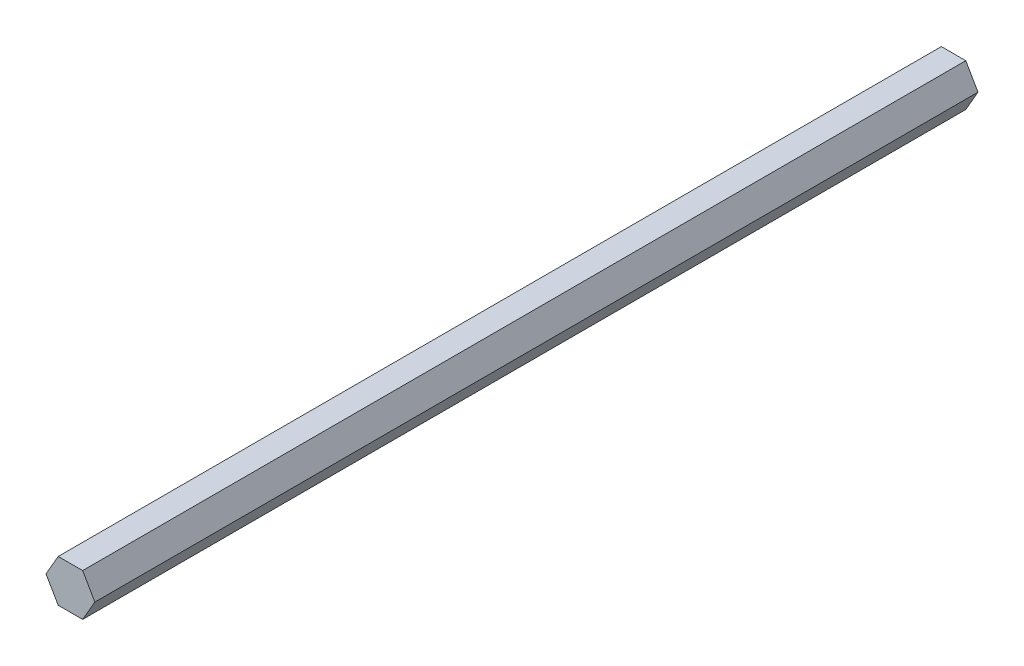
ISO-10303-21;
HEADER;
FILE_DESCRIPTION(('STEP AP214'),'2;1');
FILE_NAME('part.step','',(''),(''),'','','');
FILE_SCHEMA(('AUTOMOTIVE_DESIGN { 1 0 10303 214 1 1 1 1 }'));
ENDSEC;
DATA;
#1=APPLICATION_CONTEXT('core data for automotive mechanical design processes');
#2=APPLICATION_PROTOCOL_DEFINITION('international standard','automotive_design',2000,#1);
#3=PRODUCT_CONTEXT('',#1,'mechanical');
#4=PRODUCT('Part','Part','',(#3));
#5=PRODUCT_RELATED_PRODUCT_CATEGORY('part','',(#4));
#6=PRODUCT_DEFINITION_FORMATION('','',#4);
#7=PRODUCT_DEFINITION_CONTEXT('part definition',#1,'design');
#8=PRODUCT_DEFINITION('design','',#6,#7);
#9=PRODUCT_DEFINITION_SHAPE('','',#8);
#10=(LENGTH_UNIT() NAMED_UNIT(*) SI_UNIT(.MILLI.,.METRE.));
#11=(NAMED_UNIT(*) PLANE_ANGLE_UNIT() SI_UNIT($,.RADIAN.));
#12=(NAMED_UNIT(*) SI_UNIT($,.STERADIAN.) SOLID_ANGLE_UNIT());
#13=UNCERTAINTY_MEASURE_WITH_UNIT(LENGTH_MEASURE(1.E-05),#10,'distance_accuracy_value','');
#14=(GEOMETRIC_REPRESENTATION_CONTEXT(3) GLOBAL_UNCERTAINTY_ASSIGNED_CONTEXT((#13)) GLOBAL_UNIT_ASSIGNED_CONTEXT((#10,
#11,#12)) REPRESENTATION_CONTEXT('',''));
#15=CARTESIAN_POINT('',(0.,0.,0.));
#16=DIRECTION('',(0.,0.,1.));
#17=DIRECTION('',(1.,0.,0.));
#18=AXIS2_PLACEMENT_3D('',#15,#16,#17);
#19=CARTESIAN_POINT('',(3.6661742093542,-6.34999999999996,132.5));
#20=DIRECTION('',(-0.866025403784442,0.499999999999995,0.));
#21=DIRECTION('',(-0.499999999999995,-0.866025403784442,0.));
#22=AXIS2_PLACEMENT_3D('',#19,#20,#21);
#23=PLANE('',#22);
#24=DIRECTION('',(0.499999999999995,0.866025403784442,0.));
#25=VECTOR('',#24,1.);
#26=CARTESIAN_POINT('',(3.6661742093542,-6.34999999999996,-132.5));
#27=LINE('',#26,#25);
#28=CARTESIAN_POINT('',(3.6661742093542,-6.34999999999996,-132.5));
#29=VERTEX_POINT('',#28);
#30=CARTESIAN_POINT('',(7.33234841870825,0.,-132.5));
#31=VERTEX_POINT('',#30);
#32=EDGE_CURVE('E123',#29,#31,#27,.T.);
#33=ORIENTED_EDGE('',*,*,#32,.T.);
#34=DIRECTION('',(0.,0.,-1.));
#35=VECTOR('',#34,1.);
#36=CARTESIAN_POINT('',(7.33234841870825,0.,132.5));
#37=LINE('',#36,#35);
#38=CARTESIAN_POINT('',(7.33234841870825,0.,132.5));
#39=VERTEX_POINT('',#38);
#40=EDGE_CURVE('E11',#39,#31,#37,.T.);
#41=ORIENTED_EDGE('',*,*,#40,.F.);
#42=DIRECTION('',(0.499999999999995,0.866025403784442,0.));
#43=VECTOR('',#42,1.);
#44=CARTESIAN_POINT('',(3.6661742093542,-6.34999999999996,132.5));
#45=LINE('',#44,#43);
#46=CARTESIAN_POINT('',(3.6661742093542,-6.34999999999996,132.5));
#47=VERTEX_POINT('',#46);
#48=EDGE_CURVE('E133',#47,#39,#45,.T.);
#49=ORIENTED_EDGE('',*,*,#48,.F.);
#50=DIRECTION('',(0.,0.,-1.));
#51=VECTOR('',#50,1.);
#52=CARTESIAN_POINT('',(3.6661742093542,-6.34999999999996,132.5));
#53=LINE('',#52,#51);
#54=EDGE_CURVE('E119',#47,#29,#53,.T.);
#55=ORIENTED_EDGE('',*,*,#54,.T.);
#56=EDGE_LOOP('',(#33,#41,#49,#55));
#57=FACE_BOUND('',#56,.T.);
#58=ADVANCED_FACE('F39',(#57),#23,.F.);
#59=CARTESIAN_POINT('',(7.33234841870825,0.,132.5));
#60=DIRECTION('',(-0.866025403784438,-0.500000000000001,0.));
#61=DIRECTION('',(0.500000000000001,-0.866025403784438,0.));
#62=AXIS2_PLACEMENT_3D('',#59,#60,#61);
#63=PLANE('',#62);
#64=DIRECTION('',(-0.500000000000001,0.866025403784438,0.));
#65=VECTOR('',#64,1.);
#66=CARTESIAN_POINT('',(7.33234841870825,0.,-132.5));
#67=LINE('',#66,#65);
#68=CARTESIAN_POINT('',(3.66617420935411,6.35000000000001,-132.5));
#69=VERTEX_POINT('',#68);
#70=EDGE_CURVE('E126',#31,#69,#67,.T.);
#71=ORIENTED_EDGE('',*,*,#70,.T.);
#72=DIRECTION('',(0.,0.,-1.));
#73=VECTOR('',#72,1.);
#74=CARTESIAN_POINT('',(3.66617420935411,6.35000000000001,132.5));
#75=LINE('',#74,#73);
#76=CARTESIAN_POINT('',(3.66617420935411,6.35000000000001,132.5));
#77=VERTEX_POINT('',#76);
#78=EDGE_CURVE('E47',#77,#69,#75,.T.);
#79=ORIENTED_EDGE('',*,*,#78,.F.);
#80=DIRECTION('',(-0.500000000000001,0.866025403784438,0.));
#81=VECTOR('',#80,1.);
#82=CARTESIAN_POINT('',(7.33234841870825,0.,132.5));
#83=LINE('',#82,#81);
#84=EDGE_CURVE('E92',#39,#77,#83,.T.);
#85=ORIENTED_EDGE('',*,*,#84,.F.);
#86=ORIENTED_EDGE('',*,*,#40,.T.);
#87=EDGE_LOOP('',(#71,#79,#85,#86));
#88=FACE_BOUND('',#87,.T.);
#89=ADVANCED_FACE('F157',(#88),#63,.F.);
#90=CARTESIAN_POINT('',(3.66617420935411,6.35000000000001,132.5));
#91=DIRECTION('',(0.,-1.,0.));
#92=DIRECTION('',(1.,0.,0.));
#93=AXIS2_PLACEMENT_3D('',#90,#91,#92);
#94=PLANE('',#93);
#95=DIRECTION('',(-1.,0.,0.));
#96=VECTOR('',#95,1.);
#97=CARTESIAN_POINT('',(3.66617420935411,6.35000000000001,-132.5));
#98=LINE('',#97,#96);
#99=CARTESIAN_POINT('',(-3.66617420935415,6.34999999999999,-132.5));
#100=VERTEX_POINT('',#99);
#101=EDGE_CURVE('E128',#69,#100,#98,.T.);
#102=ORIENTED_EDGE('',*,*,#101,.T.);
#103=DIRECTION('',(0.,0.,-1.));
#104=VECTOR('',#103,1.);
#105=CARTESIAN_POINT('',(-3.66617420935415,6.34999999999999,132.5));
#106=LINE('',#105,#104);
#107=CARTESIAN_POINT('',(-3.66617420935415,6.34999999999999,132.5));
#108=VERTEX_POINT('',#107);
#109=EDGE_CURVE('E114',#108,#100,#106,.T.);
#110=ORIENTED_EDGE('',*,*,#109,.F.);
#111=DIRECTION('',(-1.,0.,0.));
#112=VECTOR('',#111,1.);
#113=CARTESIAN_POINT('',(3.66617420935411,6.35000000000001,132.5));
#114=LINE('',#113,#112);
#115=EDGE_CURVE('E105',#77,#108,#114,.T.);
#116=ORIENTED_EDGE('',*,*,#115,.F.);
#117=ORIENTED_EDGE('',*,*,#78,.T.);
#118=EDGE_LOOP('',(#102,#110,#116,#117));
#119=FACE_BOUND('',#118,.T.);
#120=ADVANCED_FACE('F139',(#119),#94,.F.);
#121=CARTESIAN_POINT('',(-3.66617420935415,6.34999999999999,132.5));
#122=DIRECTION('',(0.866025403784442,-0.499999999999995,0.));
#123=DIRECTION('',(0.499999999999995,0.866025403784442,0.));
#124=AXIS2_PLACEMENT_3D('',#121,#122,#123);
#125=PLANE('',#124);
#126=DIRECTION('',(-0.499999999999995,-0.866025403784442,0.));
#127=VECTOR('',#126,1.);
#128=CARTESIAN_POINT('',(-3.66617420935415,6.34999999999999,-132.5));
#129=LINE('',#128,#127);
#130=CARTESIAN_POINT('',(-7.33234841870825,0.,-132.5));
#131=VERTEX_POINT('',#130);
#132=EDGE_CURVE('E113',#100,#131,#129,.T.);
#133=ORIENTED_EDGE('',*,*,#132,.T.);
#134=DIRECTION('',(0.,0.,-1.));
#135=VECTOR('',#134,1.);
#136=CARTESIAN_POINT('',(-7.33234841870825,0.,132.5));
#137=LINE('',#136,#135);
#138=CARTESIAN_POINT('',(-7.33234841870825,0.,132.5));
#139=VERTEX_POINT('',#138);
#140=EDGE_CURVE('E110',#139,#131,#137,.T.);
#141=ORIENTED_EDGE('',*,*,#140,.F.);
#142=DIRECTION('',(-0.499999999999995,-0.866025403784442,0.));
#143=VECTOR('',#142,1.);
#144=CARTESIAN_POINT('',(-3.66617420935415,6.34999999999999,132.5));
#145=LINE('',#144,#143);
#146=EDGE_CURVE('E99',#108,#139,#145,.T.);
#147=ORIENTED_EDGE('',*,*,#146,.F.);
#148=ORIENTED_EDGE('',*,*,#109,.T.);
#149=EDGE_LOOP('',(#133,#141,#147,#148));
#150=FACE_BOUND('',#149,.T.);
#151=ADVANCED_FACE('F111',(#150),#125,.F.);
#152=CARTESIAN_POINT('',(-7.33234841870825,0.,132.5));
#153=DIRECTION('',(0.866025403784435,0.500000000000007,0.));
#154=DIRECTION('',(-0.500000000000007,0.866025403784435,0.));
#155=AXIS2_PLACEMENT_3D('',#152,#153,#154);
#156=PLANE('',#155);
#157=DIRECTION('',(0.500000000000007,-0.866025403784435,0.));
#158=VECTOR('',#157,1.);
#159=CARTESIAN_POINT('',(-7.33234841870825,0.,-132.5));
#160=LINE('',#159,#158);
#161=CARTESIAN_POINT('',(-3.66617420935407,-6.35000000000004,-132.5));
#162=VERTEX_POINT('',#161);
#163=EDGE_CURVE('E78',#131,#162,#160,.T.);
#164=ORIENTED_EDGE('',*,*,#163,.T.);
#165=DIRECTION('',(0.,0.,-1.));
#166=VECTOR('',#165,1.);
#167=CARTESIAN_POINT('',(-3.66617420935407,-6.35000000000004,132.5));
#168=LINE('',#167,#166);
#169=CARTESIAN_POINT('',(-3.66617420935407,-6.35000000000004,132.5));
#170=VERTEX_POINT('',#169);
#171=EDGE_CURVE('E115',#170,#162,#168,.T.);
#172=ORIENTED_EDGE('',*,*,#171,.F.);
#173=DIRECTION('',(0.500000000000007,-0.866025403784435,0.));
#174=VECTOR('',#173,1.);
#175=CARTESIAN_POINT('',(-7.33234841870825,0.,132.5));
#176=LINE('',#175,#174);
#177=EDGE_CURVE('E103',#139,#170,#176,.T.);
#178=ORIENTED_EDGE('',*,*,#177,.F.);
#179=ORIENTED_EDGE('',*,*,#140,.T.);
#180=EDGE_LOOP('',(#164,#172,#178,#179));
#181=FACE_BOUND('',#180,.T.);
#182=ADVANCED_FACE('F117',(#181),#156,.F.);
#183=CARTESIAN_POINT('',(-3.66617420935407,-6.35000000000004,132.5));
#184=DIRECTION('',(0.,1.,0.));
#185=DIRECTION('',(-1.,0.,0.));
#186=AXIS2_PLACEMENT_3D('',#183,#184,#185);
#187=PLANE('',#186);
#188=DIRECTION('',(1.,0.,0.));
#189=VECTOR('',#188,1.);
#190=CARTESIAN_POINT('',(-3.66617420935407,-6.35000000000004,-132.5));
#191=LINE('',#190,#189);
#192=EDGE_CURVE('E84',#162,#29,#191,.T.);
#193=ORIENTED_EDGE('',*,*,#192,.T.);
#194=ORIENTED_EDGE('',*,*,#54,.F.);
#195=DIRECTION('',(1.,0.,0.));
#196=VECTOR('',#195,1.);
#197=CARTESIAN_POINT('',(-3.66617420935407,-6.35000000000004,132.5));
#198=LINE('',#197,#196);
#199=EDGE_CURVE('E55',#170,#47,#198,.T.);
#200=ORIENTED_EDGE('',*,*,#199,.F.);
#201=ORIENTED_EDGE('',*,*,#171,.T.);
#202=EDGE_LOOP('',(#193,#194,#200,#201));
#203=FACE_BOUND('',#202,.T.);
#204=ADVANCED_FACE('F146',(#203),#187,.F.);
#205=CARTESIAN_POINT('',(0.,0.,132.5));
#206=DIRECTION('',(0.,0.,1.));
#207=DIRECTION('',(1.,0.,0.));
#208=AXIS2_PLACEMENT_3D('',#205,#206,#207);
#209=PLANE('',#208);
#210=ORIENTED_EDGE('',*,*,#48,.T.);
#211=ORIENTED_EDGE('',*,*,#84,.T.);
#212=ORIENTED_EDGE('',*,*,#115,.T.);
#213=ORIENTED_EDGE('',*,*,#146,.T.);
#214=ORIENTED_EDGE('',*,*,#177,.T.);
#215=ORIENTED_EDGE('',*,*,#199,.T.);
#216=EDGE_LOOP('',(#210,#211,#212,#213,#214,#215));
#217=FACE_BOUND('',#216,.T.);
#218=ADVANCED_FACE('F101',(#217),#209,.T.);
#219=CARTESIAN_POINT('',(0.,0.,-132.5));
#220=DIRECTION('',(0.,0.,1.));
#221=DIRECTION('',(1.,0.,0.));
#222=AXIS2_PLACEMENT_3D('',#219,#220,#221);
#223=PLANE('',#222);
#224=ORIENTED_EDGE('',*,*,#32,.F.);
#225=ORIENTED_EDGE('',*,*,#192,.F.);
#226=ORIENTED_EDGE('',*,*,#163,.F.);
#227=ORIENTED_EDGE('',*,*,#132,.F.);
#228=ORIENTED_EDGE('',*,*,#101,.F.);
#229=ORIENTED_EDGE('',*,*,#70,.F.);
#230=EDGE_LOOP('',(#224,#225,#226,#227,#228,#229));
#231=FACE_BOUND('',#230,.T.);
#232=ADVANCED_FACE('F142',(#231),#223,.F.);
#233=CLOSED_SHELL('',(#58,#89,#120,#151,#182,#204,#218,#232));
#234=MANIFOLD_SOLID_BREP('B2',#233);
#235=ADVANCED_BREP_SHAPE_REPRESENTATION('',(#18,#234),#14);
#236=SHAPE_DEFINITION_REPRESENTATION(#9,#235);
ENDSEC;
END-ISO-10303-21;
